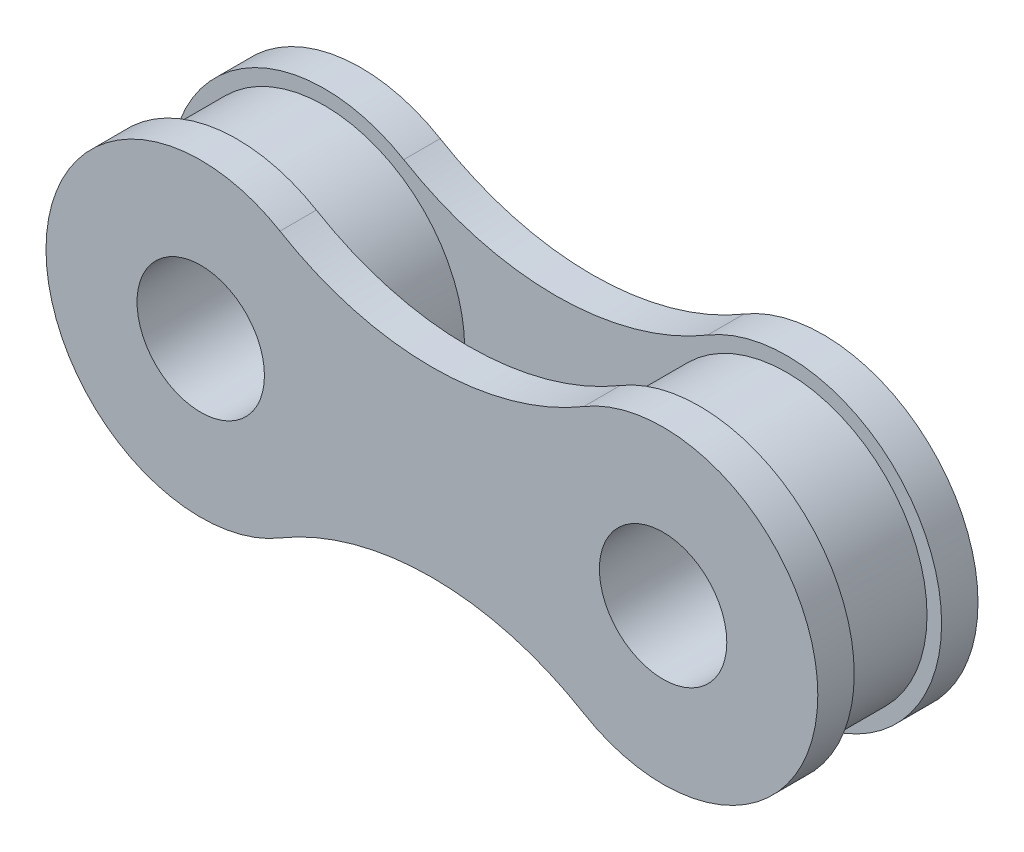
ISO-10303-21;
HEADER;
FILE_DESCRIPTION(('STEP AP214'),'2;1');
FILE_NAME('part.step','',(''),(''),'','','');
FILE_SCHEMA(('AUTOMOTIVE_DESIGN { 1 0 10303 214 1 1 1 1 }'));
ENDSEC;
DATA;
#1=APPLICATION_CONTEXT('core data for automotive mechanical design processes');
#2=APPLICATION_PROTOCOL_DEFINITION('international standard','automotive_design',2000,#1);
#3=PRODUCT_CONTEXT('',#1,'mechanical');
#4=PRODUCT('Part','Part','',(#3));
#5=PRODUCT_RELATED_PRODUCT_CATEGORY('part','',(#4));
#6=PRODUCT_DEFINITION_FORMATION('','',#4);
#7=PRODUCT_DEFINITION_CONTEXT('part definition',#1,'design');
#8=PRODUCT_DEFINITION('design','',#6,#7);
#9=PRODUCT_DEFINITION_SHAPE('','',#8);
#10=(LENGTH_UNIT() NAMED_UNIT(*) SI_UNIT(.MILLI.,.METRE.));
#11=(NAMED_UNIT(*) PLANE_ANGLE_UNIT() SI_UNIT($,.RADIAN.));
#12=(NAMED_UNIT(*) SI_UNIT($,.STERADIAN.) SOLID_ANGLE_UNIT());
#13=UNCERTAINTY_MEASURE_WITH_UNIT(LENGTH_MEASURE(1.E-05),#10,'distance_accuracy_value','');
#14=(GEOMETRIC_REPRESENTATION_CONTEXT(3) GLOBAL_UNCERTAINTY_ASSIGNED_CONTEXT((#13)) GLOBAL_UNIT_ASSIGNED_CONTEXT((#10,
#11,#12)) REPRESENTATION_CONTEXT('',''));
#15=CARTESIAN_POINT('',(0.,0.,0.));
#16=DIRECTION('',(0.,0.,1.));
#17=DIRECTION('',(1.,0.,0.));
#18=AXIS2_PLACEMENT_3D('',#15,#16,#17);
#19=CARTESIAN_POINT('',(3.175,5.32285714285713,1.));
#20=DIRECTION('',(0.,0.,-1.));
#21=DIRECTION('',(-1.,0.,0.));
#22=AXIS2_PLACEMENT_3D('',#19,#20,#21);
#23=PLANE('',#22);
#24=CARTESIAN_POINT('',(0.,0.,0.999999999976353));
#25=DIRECTION('',(0.,0.,-1.));
#26=DIRECTION('',(-1.,0.,0.));
#27=AXIS2_PLACEMENT_3D('',#24,#25,#26);
#28=CIRCLE('',#27,3.85);
#29=CARTESIAN_POINT('',(-3.85,0.,0.999999999976353));
#30=VERTEX_POINT('',#29);
#31=EDGE_CURVE('E59',#30,#30,#28,.F.);
#32=ORIENTED_EDGE('',*,*,#31,.F.);
#33=EDGE_LOOP('',(#32));
#34=FACE_BOUND('',#33,.T.);
#35=CARTESIAN_POINT('',(6.35,10.6457142857143,1.));
#36=DIRECTION('',(0.,0.,-1.));
#37=DIRECTION('',(-1.,0.,0.));
#38=AXIS2_PLACEMENT_3D('',#35,#36,#37);
#39=CIRCLE('',#38,8.14571428571425);
#40=CARTESIAN_POINT('',(10.5228362337213,3.64999423763974,1.));
#41=VERTEX_POINT('',#40);
#42=CARTESIAN_POINT('',(2.17716376627867,3.64999423763974,1.));
#43=VERTEX_POINT('',#42);
#44=EDGE_CURVE('E167',#41,#43,#39,.T.);
#45=ORIENTED_EDGE('',*,*,#44,.T.);
#46=CARTESIAN_POINT('',(0.,0.,1.));
#47=DIRECTION('',(0.,0.,1.));
#48=DIRECTION('',(1.,0.,0.));
#49=AXIS2_PLACEMENT_3D('',#46,#47,#48);
#50=CIRCLE('',#49,4.25);
#51=CARTESIAN_POINT('',(2.17716376627867,-3.64999423763974,1.));
#52=VERTEX_POINT('',#51);
#53=EDGE_CURVE('E99',#43,#52,#50,.T.);
#54=ORIENTED_EDGE('',*,*,#53,.T.);
#55=CARTESIAN_POINT('',(6.35,-10.6457142857143,1.));
#56=DIRECTION('',(0.,0.,-1.));
#57=DIRECTION('',(1.,0.,0.));
#58=AXIS2_PLACEMENT_3D('',#55,#56,#57);
#59=CIRCLE('',#58,8.14571428571425);
#60=CARTESIAN_POINT('',(10.5228362337213,-3.64999423763974,1.));
#61=VERTEX_POINT('',#60);
#62=EDGE_CURVE('E170',#52,#61,#59,.T.);
#63=ORIENTED_EDGE('',*,*,#62,.T.);
#64=CARTESIAN_POINT('',(12.7,0.,1.));
#65=DIRECTION('',(0.,0.,1.));
#66=DIRECTION('',(1.,0.,0.));
#67=AXIS2_PLACEMENT_3D('',#64,#65,#66);
#68=CIRCLE('',#67,4.25);
#69=EDGE_CURVE('E67',#61,#41,#68,.T.);
#70=ORIENTED_EDGE('',*,*,#69,.T.);
#71=EDGE_LOOP('',(#45,#54,#63,#70));
#72=FACE_BOUND('',#71,.T.);
#73=CARTESIAN_POINT('',(12.7,0.,0.999999999976353));
#74=DIRECTION('',(0.,0.,-1.));
#75=DIRECTION('',(-1.,0.,0.));
#76=AXIS2_PLACEMENT_3D('',#73,#74,#75);
#77=CIRCLE('',#76,3.85);
#78=CARTESIAN_POINT('',(8.85,0.,0.999999999976353));
#79=VERTEX_POINT('',#78);
#80=EDGE_CURVE('E12',#79,#79,#77,.F.);
#81=ORIENTED_EDGE('',*,*,#80,.F.);
#82=EDGE_LOOP('',(#81));
#83=FACE_BOUND('',#82,.T.);
#84=ADVANCED_FACE('F50',(#34,#72,#83),#23,.F.);
#85=CARTESIAN_POINT('',(3.175,5.32285714285713,3.4));
#86=DIRECTION('',(0.,0.,-1.));
#87=DIRECTION('',(-1.,0.,0.));
#88=AXIS2_PLACEMENT_3D('',#85,#86,#87);
#89=PLANE('',#88);
#90=CARTESIAN_POINT('',(6.35,10.6457142857143,3.4));
#91=DIRECTION('',(0.,0.,-1.));
#92=DIRECTION('',(-1.,0.,0.));
#93=AXIS2_PLACEMENT_3D('',#90,#91,#92);
#94=CIRCLE('',#93,8.14571428571425);
#95=CARTESIAN_POINT('',(10.5228362337213,3.64999423763974,3.4));
#96=VERTEX_POINT('',#95);
#97=CARTESIAN_POINT('',(2.17716376627867,3.64999423763974,3.4));
#98=VERTEX_POINT('',#97);
#99=EDGE_CURVE('E151',#96,#98,#94,.T.);
#100=ORIENTED_EDGE('',*,*,#99,.F.);
#101=CARTESIAN_POINT('',(12.7,0.,3.4));
#102=DIRECTION('',(0.,0.,1.));
#103=DIRECTION('',(1.,0.,0.));
#104=AXIS2_PLACEMENT_3D('',#101,#102,#103);
#105=CIRCLE('',#104,4.25);
#106=CARTESIAN_POINT('',(10.5228362337213,-3.64999423763974,3.4));
#107=VERTEX_POINT('',#106);
#108=EDGE_CURVE('E147',#107,#96,#105,.T.);
#109=ORIENTED_EDGE('',*,*,#108,.F.);
#110=CARTESIAN_POINT('',(6.35,-10.6457142857143,3.4));
#111=DIRECTION('',(0.,0.,-1.));
#112=DIRECTION('',(1.,0.,0.));
#113=AXIS2_PLACEMENT_3D('',#110,#111,#112);
#114=CIRCLE('',#113,8.14571428571425);
#115=CARTESIAN_POINT('',(2.17716376627867,-3.64999423763974,3.4));
#116=VERTEX_POINT('',#115);
#117=EDGE_CURVE('E273',#116,#107,#114,.T.);
#118=ORIENTED_EDGE('',*,*,#117,.F.);
#119=CARTESIAN_POINT('',(0.,0.,3.4));
#120=DIRECTION('',(0.,0.,1.));
#121=DIRECTION('',(1.,0.,0.));
#122=AXIS2_PLACEMENT_3D('',#119,#120,#121);
#123=CIRCLE('',#122,4.25);
#124=EDGE_CURVE('E271',#98,#116,#123,.T.);
#125=ORIENTED_EDGE('',*,*,#124,.F.);
#126=EDGE_LOOP('',(#100,#109,#118,#125));
#127=FACE_BOUND('',#126,.T.);
#128=CARTESIAN_POINT('',(0.,0.,3.39999999999918));
#129=DIRECTION('',(0.,0.,-1.));
#130=DIRECTION('',(-1.,0.,0.));
#131=AXIS2_PLACEMENT_3D('',#128,#129,#130);
#132=CIRCLE('',#131,3.85);
#133=CARTESIAN_POINT('',(-3.85,0.,3.39999999999918));
#134=VERTEX_POINT('',#133);
#135=EDGE_CURVE('E152',#134,#134,#132,.T.);
#136=ORIENTED_EDGE('',*,*,#135,.F.);
#137=EDGE_LOOP('',(#136));
#138=FACE_BOUND('',#137,.T.);
#139=CARTESIAN_POINT('',(12.7,0.,3.39999999999918));
#140=DIRECTION('',(0.,0.,-1.));
#141=DIRECTION('',(-1.,0.,0.));
#142=AXIS2_PLACEMENT_3D('',#139,#140,#141);
#143=CIRCLE('',#142,3.85);
#144=CARTESIAN_POINT('',(8.85,0.,3.39999999999918));
#145=VERTEX_POINT('',#144);
#146=EDGE_CURVE('E261',#145,#145,#143,.T.);
#147=ORIENTED_EDGE('',*,*,#146,.F.);
#148=EDGE_LOOP('',(#147));
#149=FACE_BOUND('',#148,.T.);
#150=ADVANCED_FACE('F192',(#127,#138,#149),#89,.T.);
#151=CARTESIAN_POINT('',(3.175,5.32285714285713,0.));
#152=DIRECTION('',(0.,0.,-1.));
#153=DIRECTION('',(-1.,0.,0.));
#154=AXIS2_PLACEMENT_3D('',#151,#152,#153);
#155=PLANE('',#154);
#156=CARTESIAN_POINT('',(0.,0.,0.));
#157=DIRECTION('',(0.,0.,1.));
#158=DIRECTION('',(1.,0.,0.));
#159=AXIS2_PLACEMENT_3D('',#156,#157,#158);
#160=CIRCLE('',#159,1.75);
#161=CARTESIAN_POINT('',(1.75,0.,0.));
#162=VERTEX_POINT('',#161);
#163=EDGE_CURVE('E163',#162,#162,#160,.T.);
#164=ORIENTED_EDGE('',*,*,#163,.T.);
#165=EDGE_LOOP('',(#164));
#166=FACE_BOUND('',#165,.T.);
#167=CARTESIAN_POINT('',(6.35,10.6457142857143,0.));
#168=DIRECTION('',(0.,0.,-1.));
#169=DIRECTION('',(-1.,0.,0.));
#170=AXIS2_PLACEMENT_3D('',#167,#168,#169);
#171=CIRCLE('',#170,8.14571428571425);
#172=CARTESIAN_POINT('',(10.5228362337213,3.64999423763974,0.));
#173=VERTEX_POINT('',#172);
#174=CARTESIAN_POINT('',(2.17716376627867,3.64999423763974,0.));
#175=VERTEX_POINT('',#174);
#176=EDGE_CURVE('E166',#173,#175,#171,.T.);
#177=ORIENTED_EDGE('',*,*,#176,.F.);
#178=CARTESIAN_POINT('',(12.7,0.,0.));
#179=DIRECTION('',(0.,0.,1.));
#180=DIRECTION('',(1.,0.,0.));
#181=AXIS2_PLACEMENT_3D('',#178,#179,#180);
#182=CIRCLE('',#181,4.25);
#183=CARTESIAN_POINT('',(10.5228362337213,-3.64999423763974,0.));
#184=VERTEX_POINT('',#183);
#185=EDGE_CURVE('E91',#184,#173,#182,.T.);
#186=ORIENTED_EDGE('',*,*,#185,.F.);
#187=CARTESIAN_POINT('',(6.35,-10.6457142857143,0.));
#188=DIRECTION('',(0.,0.,-1.));
#189=DIRECTION('',(1.,0.,0.));
#190=AXIS2_PLACEMENT_3D('',#187,#188,#189);
#191=CIRCLE('',#190,8.14571428571425);
#192=CARTESIAN_POINT('',(2.17716376627867,-3.64999423763974,0.));
#193=VERTEX_POINT('',#192);
#194=EDGE_CURVE('E85',#193,#184,#191,.T.);
#195=ORIENTED_EDGE('',*,*,#194,.F.);
#196=CARTESIAN_POINT('',(0.,0.,0.));
#197=DIRECTION('',(0.,0.,1.));
#198=DIRECTION('',(1.,0.,0.));
#199=AXIS2_PLACEMENT_3D('',#196,#197,#198);
#200=CIRCLE('',#199,4.25);
#201=EDGE_CURVE('E176',#175,#193,#200,.T.);
#202=ORIENTED_EDGE('',*,*,#201,.F.);
#203=EDGE_LOOP('',(#177,#186,#195,#202));
#204=FACE_BOUND('',#203,.T.);
#205=CARTESIAN_POINT('',(12.7,0.,0.));
#206=DIRECTION('',(0.,0.,1.));
#207=DIRECTION('',(1.,0.,0.));
#208=AXIS2_PLACEMENT_3D('',#205,#206,#207);
#209=CIRCLE('',#208,1.75);
#210=CARTESIAN_POINT('',(14.45,0.,0.));
#211=VERTEX_POINT('',#210);
#212=EDGE_CURVE('E155',#211,#211,#209,.T.);
#213=ORIENTED_EDGE('',*,*,#212,.T.);
#214=EDGE_LOOP('',(#213));
#215=FACE_BOUND('',#214,.T.);
#216=ADVANCED_FACE('F215',(#166,#204,#215),#155,.T.);
#217=CARTESIAN_POINT('',(6.35,10.6457142857143,1.));
#218=DIRECTION('',(0.,0.,-1.));
#219=DIRECTION('',(-1.,0.,0.));
#220=AXIS2_PLACEMENT_3D('',#217,#218,#219);
#221=CYLINDRICAL_SURFACE('',#220,8.14571428571425);
#222=ORIENTED_EDGE('',*,*,#176,.T.);
#223=DIRECTION('',(0.,0.,-1.));
#224=VECTOR('',#223,1.);
#225=CARTESIAN_POINT('',(2.17716376627867,3.64999423763974,1.));
#226=LINE('',#225,#224);
#227=EDGE_CURVE('E185',#43,#175,#226,.T.);
#228=ORIENTED_EDGE('',*,*,#227,.F.);
#229=ORIENTED_EDGE('',*,*,#44,.F.);
#230=DIRECTION('',(0.,0.,-1.));
#231=VECTOR('',#230,1.);
#232=CARTESIAN_POINT('',(10.5228362337213,3.64999423763974,1.));
#233=LINE('',#232,#231);
#234=EDGE_CURVE('E173',#41,#173,#233,.T.);
#235=ORIENTED_EDGE('',*,*,#234,.T.);
#236=EDGE_LOOP('',(#222,#228,#229,#235));
#237=FACE_BOUND('',#236,.T.);
#238=ADVANCED_FACE('F52',(#237),#221,.F.);
#239=CARTESIAN_POINT('',(0.,0.,1.));
#240=DIRECTION('',(0.,0.,-1.));
#241=DIRECTION('',(-1.,0.,0.));
#242=AXIS2_PLACEMENT_3D('',#239,#240,#241);
#243=CYLINDRICAL_SURFACE('',#242,4.25);
#244=ORIENTED_EDGE('',*,*,#201,.T.);
#245=DIRECTION('',(0.,0.,-1.));
#246=VECTOR('',#245,1.);
#247=CARTESIAN_POINT('',(2.17716376627867,-3.64999423763974,1.));
#248=LINE('',#247,#246);
#249=EDGE_CURVE('E183',#52,#193,#248,.T.);
#250=ORIENTED_EDGE('',*,*,#249,.F.);
#251=ORIENTED_EDGE('',*,*,#53,.F.);
#252=ORIENTED_EDGE('',*,*,#227,.T.);
#253=EDGE_LOOP('',(#244,#250,#251,#252));
#254=FACE_BOUND('',#253,.T.);
#255=ADVANCED_FACE('F244',(#254),#243,.T.);
#256=CARTESIAN_POINT('',(6.35,-10.6457142857143,1.));
#257=DIRECTION('',(0.,0.,-1.));
#258=DIRECTION('',(-1.,0.,0.));
#259=AXIS2_PLACEMENT_3D('',#256,#257,#258);
#260=CYLINDRICAL_SURFACE('',#259,8.14571428571425);
#261=ORIENTED_EDGE('',*,*,#194,.T.);
#262=DIRECTION('',(0.,0.,-1.));
#263=VECTOR('',#262,1.);
#264=CARTESIAN_POINT('',(10.5228362337213,-3.64999423763974,1.));
#265=LINE('',#264,#263);
#266=EDGE_CURVE('E181',#61,#184,#265,.T.);
#267=ORIENTED_EDGE('',*,*,#266,.F.);
#268=ORIENTED_EDGE('',*,*,#62,.F.);
#269=ORIENTED_EDGE('',*,*,#249,.T.);
#270=EDGE_LOOP('',(#261,#267,#268,#269));
#271=FACE_BOUND('',#270,.T.);
#272=ADVANCED_FACE('F242',(#271),#260,.F.);
#273=CARTESIAN_POINT('',(12.7,0.,1.));
#274=DIRECTION('',(0.,0.,-1.));
#275=DIRECTION('',(-1.,0.,0.));
#276=AXIS2_PLACEMENT_3D('',#273,#274,#275);
#277=CYLINDRICAL_SURFACE('',#276,4.25);
#278=ORIENTED_EDGE('',*,*,#185,.T.);
#279=ORIENTED_EDGE('',*,*,#234,.F.);
#280=ORIENTED_EDGE('',*,*,#69,.F.);
#281=ORIENTED_EDGE('',*,*,#266,.T.);
#282=EDGE_LOOP('',(#278,#279,#280,#281));
#283=FACE_BOUND('',#282,.T.);
#284=ADVANCED_FACE('F234',(#283),#277,.T.);
#285=CARTESIAN_POINT('',(0.,0.,1.));
#286=DIRECTION('',(0.,0.,-1.));
#287=DIRECTION('',(-1.,0.,0.));
#288=AXIS2_PLACEMENT_3D('',#285,#286,#287);
#289=CYLINDRICAL_SURFACE('',#288,1.75);
#290=ORIENTED_EDGE('',*,*,#163,.F.);
#291=EDGE_LOOP('',(#290));
#292=FACE_BOUND('',#291,.T.);
#293=CARTESIAN_POINT('',(0.,0.,4.4));
#294=DIRECTION('',(0.,0.,1.));
#295=DIRECTION('',(1.,0.,0.));
#296=AXIS2_PLACEMENT_3D('',#293,#294,#295);
#297=CIRCLE('',#296,1.75);
#298=CARTESIAN_POINT('',(1.75,0.,4.4));
#299=VERTEX_POINT('',#298);
#300=EDGE_CURVE('E260',#299,#299,#297,.T.);
#301=ORIENTED_EDGE('',*,*,#300,.T.);
#302=EDGE_LOOP('',(#301));
#303=FACE_BOUND('',#302,.T.);
#304=ADVANCED_FACE('F231',(#292,#303),#289,.F.);
#305=CARTESIAN_POINT('',(12.7,0.,1.));
#306=DIRECTION('',(0.,0.,-1.));
#307=DIRECTION('',(-1.,0.,0.));
#308=AXIS2_PLACEMENT_3D('',#305,#306,#307);
#309=CYLINDRICAL_SURFACE('',#308,1.75);
#310=ORIENTED_EDGE('',*,*,#212,.F.);
#311=EDGE_LOOP('',(#310));
#312=FACE_BOUND('',#311,.T.);
#313=CARTESIAN_POINT('',(12.7,0.,4.4));
#314=DIRECTION('',(0.,0.,1.));
#315=DIRECTION('',(1.,0.,0.));
#316=AXIS2_PLACEMENT_3D('',#313,#314,#315);
#317=CIRCLE('',#316,1.75);
#318=CARTESIAN_POINT('',(14.45,0.,4.4));
#319=VERTEX_POINT('',#318);
#320=EDGE_CURVE('E258',#319,#319,#317,.T.);
#321=ORIENTED_EDGE('',*,*,#320,.T.);
#322=EDGE_LOOP('',(#321));
#323=FACE_BOUND('',#322,.T.);
#324=ADVANCED_FACE('F227',(#312,#323),#309,.F.);
#325=CARTESIAN_POINT('',(0.,0.,500000.));
#326=DIRECTION('',(0.,0.,-1.));
#327=DIRECTION('',(-1.,0.,0.));
#328=AXIS2_PLACEMENT_3D('',#325,#326,#327);
#329=CYLINDRICAL_SURFACE('',#328,3.85);
#330=ORIENTED_EDGE('',*,*,#135,.T.);
#331=EDGE_LOOP('',(#330));
#332=FACE_BOUND('',#331,.T.);
#333=ORIENTED_EDGE('',*,*,#31,.T.);
#334=EDGE_LOOP('',(#333));
#335=FACE_BOUND('',#334,.T.);
#336=ADVANCED_FACE('F189',(#332,#335),#329,.T.);
#337=CARTESIAN_POINT('',(3.175,5.32285714285713,4.4));
#338=DIRECTION('',(0.,0.,-1.));
#339=DIRECTION('',(-1.,0.,0.));
#340=AXIS2_PLACEMENT_3D('',#337,#338,#339);
#341=PLANE('',#340);
#342=CARTESIAN_POINT('',(6.35,10.6457142857143,4.4));
#343=DIRECTION('',(0.,0.,-1.));
#344=DIRECTION('',(-1.,0.,0.));
#345=AXIS2_PLACEMENT_3D('',#342,#343,#344);
#346=CIRCLE('',#345,8.14571428571425);
#347=CARTESIAN_POINT('',(10.5228362337213,3.64999423763974,4.4));
#348=VERTEX_POINT('',#347);
#349=CARTESIAN_POINT('',(2.17716376627867,3.64999423763974,4.4));
#350=VERTEX_POINT('',#349);
#351=EDGE_CURVE('E137',#348,#350,#346,.T.);
#352=ORIENTED_EDGE('',*,*,#351,.T.);
#353=CARTESIAN_POINT('',(0.,0.,4.4));
#354=DIRECTION('',(0.,0.,1.));
#355=DIRECTION('',(1.,0.,0.));
#356=AXIS2_PLACEMENT_3D('',#353,#354,#355);
#357=CIRCLE('',#356,4.25);
#358=CARTESIAN_POINT('',(2.17716376627867,-3.64999423763974,4.4));
#359=VERTEX_POINT('',#358);
#360=EDGE_CURVE('E126',#350,#359,#357,.T.);
#361=ORIENTED_EDGE('',*,*,#360,.T.);
#362=CARTESIAN_POINT('',(6.35,-10.6457142857143,4.4));
#363=DIRECTION('',(0.,0.,-1.));
#364=DIRECTION('',(1.,0.,0.));
#365=AXIS2_PLACEMENT_3D('',#362,#363,#364);
#366=CIRCLE('',#365,8.14571428571425);
#367=CARTESIAN_POINT('',(10.5228362337213,-3.64999423763974,4.4));
#368=VERTEX_POINT('',#367);
#369=EDGE_CURVE('E136',#359,#368,#366,.T.);
#370=ORIENTED_EDGE('',*,*,#369,.T.);
#371=CARTESIAN_POINT('',(12.7,0.,4.4));
#372=DIRECTION('',(0.,0.,1.));
#373=DIRECTION('',(1.,0.,0.));
#374=AXIS2_PLACEMENT_3D('',#371,#372,#373);
#375=CIRCLE('',#374,4.25);
#376=EDGE_CURVE('E143',#368,#348,#375,.T.);
#377=ORIENTED_EDGE('',*,*,#376,.T.);
#378=EDGE_LOOP('',(#352,#361,#370,#377));
#379=FACE_BOUND('',#378,.T.);
#380=ORIENTED_EDGE('',*,*,#300,.F.);
#381=EDGE_LOOP('',(#380));
#382=FACE_BOUND('',#381,.T.);
#383=ORIENTED_EDGE('',*,*,#320,.F.);
#384=EDGE_LOOP('',(#383));
#385=FACE_BOUND('',#384,.T.);
#386=ADVANCED_FACE('F140',(#379,#382,#385),#341,.F.);
#387=CARTESIAN_POINT('',(6.35,10.6457142857143,4.4));
#388=DIRECTION('',(0.,0.,-1.));
#389=DIRECTION('',(-1.,0.,0.));
#390=AXIS2_PLACEMENT_3D('',#387,#388,#389);
#391=CYLINDRICAL_SURFACE('',#390,8.14571428571425);
#392=ORIENTED_EDGE('',*,*,#99,.T.);
#393=DIRECTION('',(0.,0.,-1.));
#394=VECTOR('',#393,1.);
#395=CARTESIAN_POINT('',(2.17716376627867,3.64999423763974,4.4));
#396=LINE('',#395,#394);
#397=EDGE_CURVE('E130',#350,#98,#396,.T.);
#398=ORIENTED_EDGE('',*,*,#397,.F.);
#399=ORIENTED_EDGE('',*,*,#351,.F.);
#400=DIRECTION('',(0.,0.,-1.));
#401=VECTOR('',#400,1.);
#402=CARTESIAN_POINT('',(10.5228362337213,3.64999423763974,4.4));
#403=LINE('',#402,#401);
#404=EDGE_CURVE('E269',#348,#96,#403,.T.);
#405=ORIENTED_EDGE('',*,*,#404,.T.);
#406=EDGE_LOOP('',(#392,#398,#399,#405));
#407=FACE_BOUND('',#406,.T.);
#408=ADVANCED_FACE('F149',(#407),#391,.F.);
#409=CARTESIAN_POINT('',(0.,0.,4.4));
#410=DIRECTION('',(0.,0.,-1.));
#411=DIRECTION('',(-1.,0.,0.));
#412=AXIS2_PLACEMENT_3D('',#409,#410,#411);
#413=CYLINDRICAL_SURFACE('',#412,4.25);
#414=ORIENTED_EDGE('',*,*,#124,.T.);
#415=DIRECTION('',(0.,0.,-1.));
#416=VECTOR('',#415,1.);
#417=CARTESIAN_POINT('',(2.17716376627867,-3.64999423763974,4.4));
#418=LINE('',#417,#416);
#419=EDGE_CURVE('E133',#359,#116,#418,.T.);
#420=ORIENTED_EDGE('',*,*,#419,.F.);
#421=ORIENTED_EDGE('',*,*,#360,.F.);
#422=ORIENTED_EDGE('',*,*,#397,.T.);
#423=EDGE_LOOP('',(#414,#420,#421,#422));
#424=FACE_BOUND('',#423,.T.);
#425=ADVANCED_FACE('F128',(#424),#413,.T.);
#426=CARTESIAN_POINT('',(6.35,-10.6457142857143,4.4));
#427=DIRECTION('',(0.,0.,-1.));
#428=DIRECTION('',(-1.,0.,0.));
#429=AXIS2_PLACEMENT_3D('',#426,#427,#428);
#430=CYLINDRICAL_SURFACE('',#429,8.14571428571425);
#431=ORIENTED_EDGE('',*,*,#117,.T.);
#432=DIRECTION('',(0.,0.,-1.));
#433=VECTOR('',#432,1.);
#434=CARTESIAN_POINT('',(10.5228362337213,-3.64999423763974,4.4));
#435=LINE('',#434,#433);
#436=EDGE_CURVE('E157',#368,#107,#435,.T.);
#437=ORIENTED_EDGE('',*,*,#436,.F.);
#438=ORIENTED_EDGE('',*,*,#369,.F.);
#439=ORIENTED_EDGE('',*,*,#419,.T.);
#440=EDGE_LOOP('',(#431,#437,#438,#439));
#441=FACE_BOUND('',#440,.T.);
#442=ADVANCED_FACE('F207',(#441),#430,.F.);
#443=CARTESIAN_POINT('',(12.7,0.,4.4));
#444=DIRECTION('',(0.,0.,-1.));
#445=DIRECTION('',(-1.,0.,0.));
#446=AXIS2_PLACEMENT_3D('',#443,#444,#445);
#447=CYLINDRICAL_SURFACE('',#446,4.25);
#448=ORIENTED_EDGE('',*,*,#108,.T.);
#449=ORIENTED_EDGE('',*,*,#404,.F.);
#450=ORIENTED_EDGE('',*,*,#376,.F.);
#451=ORIENTED_EDGE('',*,*,#436,.T.);
#452=EDGE_LOOP('',(#448,#449,#450,#451));
#453=FACE_BOUND('',#452,.T.);
#454=ADVANCED_FACE('F201',(#453),#447,.T.);
#455=CARTESIAN_POINT('',(12.7,0.,500000.));
#456=DIRECTION('',(0.,0.,-1.));
#457=DIRECTION('',(-1.,0.,0.));
#458=AXIS2_PLACEMENT_3D('',#455,#456,#457);
#459=CYLINDRICAL_SURFACE('',#458,3.85);
#460=ORIENTED_EDGE('',*,*,#146,.T.);
#461=EDGE_LOOP('',(#460));
#462=FACE_BOUND('',#461,.T.);
#463=ORIENTED_EDGE('',*,*,#80,.T.);
#464=EDGE_LOOP('',(#463));
#465=FACE_BOUND('',#464,.T.);
#466=ADVANCED_FACE('F199',(#462,#465),#459,.T.);
#467=CLOSED_SHELL('',(#84,#150,#216,#238,#255,#272,#284,#304,#324,#336,#386,#408,#425,#442,#454,#466));
#468=MANIFOLD_SOLID_BREP('B2',#467);
#469=ADVANCED_BREP_SHAPE_REPRESENTATION('',(#18,#468),#14);
#470=SHAPE_DEFINITION_REPRESENTATION(#9,#469);
ENDSEC;
END-ISO-10303-21;
